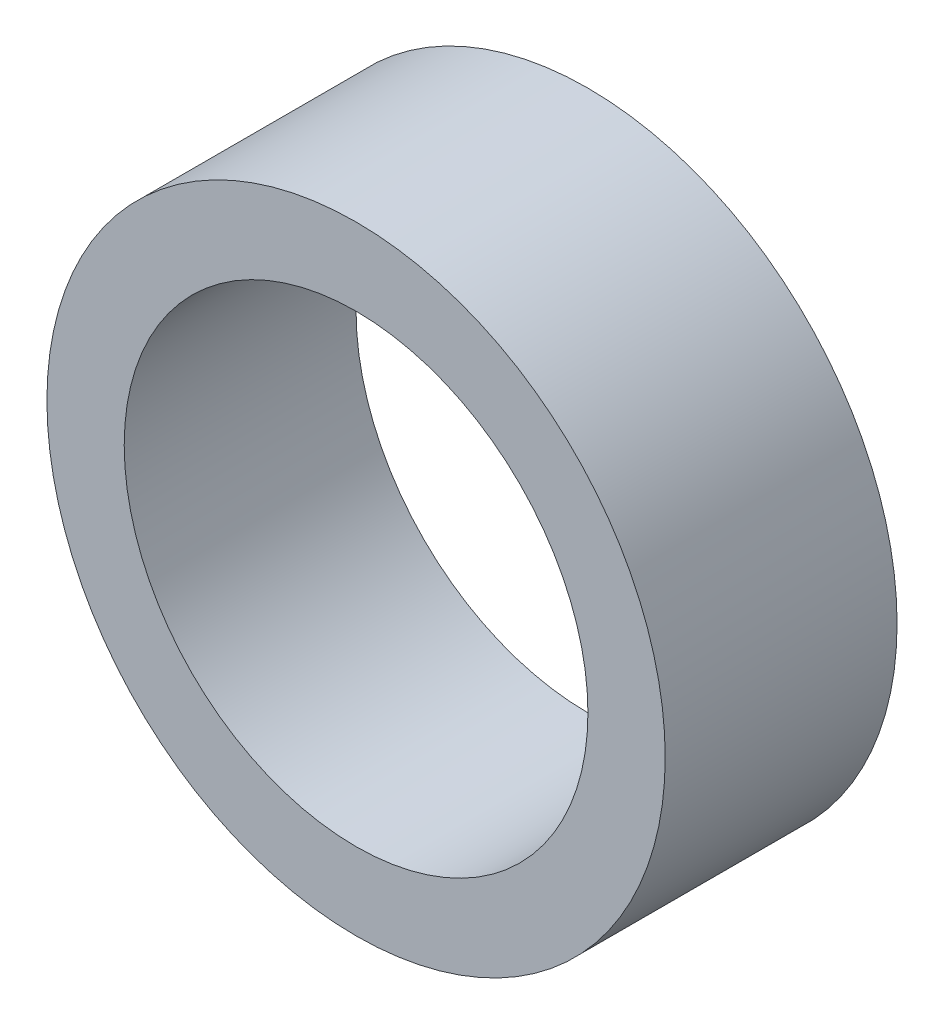
ISO-10303-21;
HEADER;
FILE_DESCRIPTION(('STEP AP214'),'2;1');
FILE_NAME('part.step','',(''),(''),'','','');
FILE_SCHEMA(('AUTOMOTIVE_DESIGN { 1 0 10303 214 1 1 1 1 }'));
ENDSEC;
DATA;
#1=APPLICATION_CONTEXT('core data for automotive mechanical design processes');
#2=APPLICATION_PROTOCOL_DEFINITION('international standard','automotive_design',2000,#1);
#3=PRODUCT_CONTEXT('',#1,'mechanical');
#4=PRODUCT('Part','Part','',(#3));
#5=PRODUCT_RELATED_PRODUCT_CATEGORY('part','',(#4));
#6=PRODUCT_DEFINITION_FORMATION('','',#4);
#7=PRODUCT_DEFINITION_CONTEXT('part definition',#1,'design');
#8=PRODUCT_DEFINITION('design','',#6,#7);
#9=PRODUCT_DEFINITION_SHAPE('','',#8);
#10=(LENGTH_UNIT() NAMED_UNIT(*) SI_UNIT(.MILLI.,.METRE.));
#11=(NAMED_UNIT(*) PLANE_ANGLE_UNIT() SI_UNIT($,.RADIAN.));
#12=(NAMED_UNIT(*) SI_UNIT($,.STERADIAN.) SOLID_ANGLE_UNIT());
#13=UNCERTAINTY_MEASURE_WITH_UNIT(LENGTH_MEASURE(1.E-05),#10,'distance_accuracy_value','');
#14=(GEOMETRIC_REPRESENTATION_CONTEXT(3) GLOBAL_UNCERTAINTY_ASSIGNED_CONTEXT((#13)) GLOBAL_UNIT_ASSIGNED_CONTEXT((#10,
#11,#12)) REPRESENTATION_CONTEXT('',''));
#15=CARTESIAN_POINT('',(0.,0.,0.));
#16=DIRECTION('',(0.,0.,1.));
#17=DIRECTION('',(1.,0.,0.));
#18=AXIS2_PLACEMENT_3D('',#15,#16,#17);
#19=CARTESIAN_POINT('',(0.,0.,3.));
#20=DIRECTION('',(0.,0.,1.));
#21=DIRECTION('',(1.,0.,0.));
#22=AXIS2_PLACEMENT_3D('',#19,#20,#21);
#23=PLANE('',#22);
#24=CARTESIAN_POINT('',(0.,0.,3.));
#25=DIRECTION('',(0.,0.,1.));
#26=DIRECTION('',(1.,0.,0.));
#27=AXIS2_PLACEMENT_3D('',#24,#25,#26);
#28=CIRCLE('',#27,4.);
#29=CARTESIAN_POINT('',(4.,0.,3.));
#30=VERTEX_POINT('',#29);
#31=EDGE_CURVE('E10',#30,#30,#28,.T.);
#32=ORIENTED_EDGE('',*,*,#31,.T.);
#33=EDGE_LOOP('',(#32));
#34=FACE_BOUND('',#33,.T.);
#35=CARTESIAN_POINT('',(0.,0.,3.));
#36=DIRECTION('',(0.,0.,1.));
#37=DIRECTION('',(1.,0.,0.));
#38=AXIS2_PLACEMENT_3D('',#35,#36,#37);
#39=CIRCLE('',#38,3.);
#40=CARTESIAN_POINT('',(3.,0.,3.));
#41=VERTEX_POINT('',#40);
#42=EDGE_CURVE('E46',#41,#41,#39,.T.);
#43=ORIENTED_EDGE('',*,*,#42,.F.);
#44=EDGE_LOOP('',(#43));
#45=FACE_BOUND('',#44,.T.);
#46=ADVANCED_FACE('F35',(#34,#45),#23,.T.);
#47=CARTESIAN_POINT('',(0.,0.,0.));
#48=DIRECTION('',(0.,0.,1.));
#49=DIRECTION('',(1.,0.,0.));
#50=AXIS2_PLACEMENT_3D('',#47,#48,#49);
#51=PLANE('',#50);
#52=CARTESIAN_POINT('',(0.,0.,0.));
#53=DIRECTION('',(0.,0.,1.));
#54=DIRECTION('',(1.,0.,0.));
#55=AXIS2_PLACEMENT_3D('',#52,#53,#54);
#56=CIRCLE('',#55,4.);
#57=CARTESIAN_POINT('',(4.,0.,0.));
#58=VERTEX_POINT('',#57);
#59=EDGE_CURVE('E39',#58,#58,#56,.T.);
#60=ORIENTED_EDGE('',*,*,#59,.F.);
#61=EDGE_LOOP('',(#60));
#62=FACE_BOUND('',#61,.T.);
#63=CARTESIAN_POINT('',(0.,0.,0.));
#64=DIRECTION('',(0.,0.,1.));
#65=DIRECTION('',(1.,0.,0.));
#66=AXIS2_PLACEMENT_3D('',#63,#64,#65);
#67=CIRCLE('',#66,3.);
#68=CARTESIAN_POINT('',(3.,0.,0.));
#69=VERTEX_POINT('',#68);
#70=EDGE_CURVE('E48',#69,#69,#67,.T.);
#71=ORIENTED_EDGE('',*,*,#70,.T.);
#72=EDGE_LOOP('',(#71));
#73=FACE_BOUND('',#72,.T.);
#74=ADVANCED_FACE('F58',(#62,#73),#51,.F.);
#75=CARTESIAN_POINT('',(0.,0.,3.));
#76=DIRECTION('',(0.,0.,-1.));
#77=DIRECTION('',(-1.,0.,0.));
#78=AXIS2_PLACEMENT_3D('',#75,#76,#77);
#79=CYLINDRICAL_SURFACE('',#78,4.);
#80=ORIENTED_EDGE('',*,*,#31,.F.);
#81=EDGE_LOOP('',(#80));
#82=FACE_BOUND('',#81,.T.);
#83=ORIENTED_EDGE('',*,*,#59,.T.);
#84=EDGE_LOOP('',(#83));
#85=FACE_BOUND('',#84,.T.);
#86=ADVANCED_FACE('F37',(#82,#85),#79,.T.);
#87=CARTESIAN_POINT('',(0.,0.,3.));
#88=DIRECTION('',(0.,0.,-1.));
#89=DIRECTION('',(-1.,0.,0.));
#90=AXIS2_PLACEMENT_3D('',#87,#88,#89);
#91=CYLINDRICAL_SURFACE('',#90,3.);
#92=ORIENTED_EDGE('',*,*,#42,.T.);
#93=EDGE_LOOP('',(#92));
#94=FACE_BOUND('',#93,.T.);
#95=ORIENTED_EDGE('',*,*,#70,.F.);
#96=EDGE_LOOP('',(#95));
#97=FACE_BOUND('',#96,.T.);
#98=ADVANCED_FACE('F54',(#94,#97),#91,.F.);
#99=CLOSED_SHELL('',(#46,#74,#86,#98));
#100=MANIFOLD_SOLID_BREP('B2',#99);
#101=ADVANCED_BREP_SHAPE_REPRESENTATION('',(#18,#100),#14);
#102=SHAPE_DEFINITION_REPRESENTATION(#9,#101);
ENDSEC;
END-ISO-10303-21;
